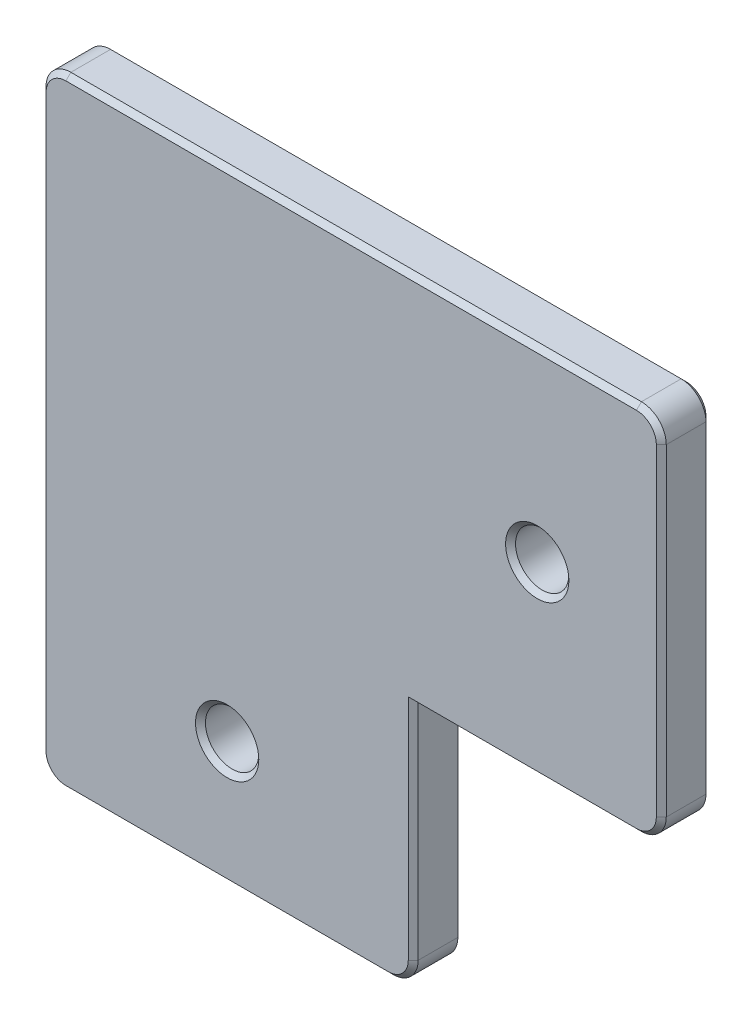
ISO-10303-21;
HEADER;
FILE_DESCRIPTION(('STEP AP214'),'2;1');
FILE_NAME('part.step','',(''),(''),'','','');
FILE_SCHEMA(('AUTOMOTIVE_DESIGN { 1 0 10303 214 1 1 1 1 }'));
ENDSEC;
DATA;
#1=APPLICATION_CONTEXT('core data for automotive mechanical design processes');
#2=APPLICATION_PROTOCOL_DEFINITION('international standard','automotive_design',2000,#1);
#3=PRODUCT_CONTEXT('',#1,'mechanical');
#4=PRODUCT('Part','Part','',(#3));
#5=PRODUCT_RELATED_PRODUCT_CATEGORY('part','',(#4));
#6=PRODUCT_DEFINITION_FORMATION('','',#4);
#7=PRODUCT_DEFINITION_CONTEXT('part definition',#1,'design');
#8=PRODUCT_DEFINITION('design','',#6,#7);
#9=PRODUCT_DEFINITION_SHAPE('','',#8);
#10=(LENGTH_UNIT() NAMED_UNIT(*) SI_UNIT(.MILLI.,.METRE.));
#11=(NAMED_UNIT(*) PLANE_ANGLE_UNIT() SI_UNIT($,.RADIAN.));
#12=(NAMED_UNIT(*) SI_UNIT($,.STERADIAN.) SOLID_ANGLE_UNIT());
#13=UNCERTAINTY_MEASURE_WITH_UNIT(LENGTH_MEASURE(1.E-05),#10,'distance_accuracy_value','');
#14=(GEOMETRIC_REPRESENTATION_CONTEXT(3) GLOBAL_UNCERTAINTY_ASSIGNED_CONTEXT((#13)) GLOBAL_UNIT_ASSIGNED_CONTEXT((#10,
#11,#12)) REPRESENTATION_CONTEXT('',''));
#15=CARTESIAN_POINT('',(0.,0.,0.));
#16=DIRECTION('',(0.,0.,1.));
#17=DIRECTION('',(1.,0.,0.));
#18=AXIS2_PLACEMENT_3D('',#15,#16,#17);
#19=CARTESIAN_POINT('',(0.,0.,4.));
#20=DIRECTION('',(0.,0.,1.));
#21=DIRECTION('',(1.,0.,0.));
#22=AXIS2_PLACEMENT_3D('',#19,#20,#21);
#23=PLANE('',#22);
#24=CARTESIAN_POINT('',(40.0000000000003,-15.,4.));
#25=DIRECTION('',(0.,0.,1.));
#26=DIRECTION('',(1.,0.,0.));
#27=AXIS2_PLACEMENT_3D('',#24,#25,#26);
#28=CIRCLE('',#27,2.55);
#29=CARTESIAN_POINT('',(42.5500000000003,-15.,4.));
#30=VERTEX_POINT('',#29);
#31=EDGE_CURVE('E223',#30,#30,#28,.F.);
#32=ORIENTED_EDGE('',*,*,#31,.T.);
#33=EDGE_LOOP('',(#32));
#34=FACE_BOUND('',#33,.T.);
#35=DIRECTION('',(0.,1.,0.));
#36=VECTOR('',#35,1.);
#37=CARTESIAN_POINT('',(49.6000000000003,-2.,4.));
#38=LINE('',#37,#36);
#39=CARTESIAN_POINT('',(49.6000000000003,-28.,4.));
#40=VERTEX_POINT('',#39);
#41=CARTESIAN_POINT('',(49.6000000000003,-2.,4.));
#42=VERTEX_POINT('',#41);
#43=EDGE_CURVE('E220',#40,#42,#38,.T.);
#44=ORIENTED_EDGE('',*,*,#43,.T.);
#45=CARTESIAN_POINT('',(48.0000000000003,-2.,4.));
#46=DIRECTION('',(0.,0.,1.));
#47=DIRECTION('',(1.,0.,0.));
#48=AXIS2_PLACEMENT_3D('',#45,#46,#47);
#49=CIRCLE('',#48,1.6);
#50=CARTESIAN_POINT('',(48.0000000000003,-0.399999999999998,4.));
#51=VERTEX_POINT('',#50);
#52=EDGE_CURVE('E199',#42,#51,#49,.T.);
#53=ORIENTED_EDGE('',*,*,#52,.T.);
#54=DIRECTION('',(-1.,0.,0.));
#55=VECTOR('',#54,1.);
#56=CARTESIAN_POINT('',(2.,-0.399999999999998,4.));
#57=LINE('',#56,#55);
#58=CARTESIAN_POINT('',(2.,-0.399999999999998,4.));
#59=VERTEX_POINT('',#58);
#60=EDGE_CURVE('E208',#51,#59,#57,.T.);
#61=ORIENTED_EDGE('',*,*,#60,.T.);
#62=CARTESIAN_POINT('',(2.,-2.,4.));
#63=DIRECTION('',(0.,0.,1.));
#64=DIRECTION('',(1.,0.,0.));
#65=AXIS2_PLACEMENT_3D('',#62,#63,#64);
#66=CIRCLE('',#65,1.6);
#67=CARTESIAN_POINT('',(0.399999999999998,-2.,4.));
#68=VERTEX_POINT('',#67);
#69=EDGE_CURVE('E215',#59,#68,#66,.T.);
#70=ORIENTED_EDGE('',*,*,#69,.T.);
#71=DIRECTION('',(0.,-1.,0.));
#72=VECTOR('',#71,1.);
#73=CARTESIAN_POINT('',(0.399999999999998,-48.,4.));
#74=LINE('',#73,#72);
#75=CARTESIAN_POINT('',(0.399999999999998,-48.,4.));
#76=VERTEX_POINT('',#75);
#77=EDGE_CURVE('E499',#68,#76,#74,.T.);
#78=ORIENTED_EDGE('',*,*,#77,.T.);
#79=CARTESIAN_POINT('',(2.,-48.,4.));
#80=DIRECTION('',(0.,0.,1.));
#81=DIRECTION('',(1.,0.,0.));
#82=AXIS2_PLACEMENT_3D('',#79,#80,#81);
#83=CIRCLE('',#82,1.6);
#84=CARTESIAN_POINT('',(2.,-49.6,4.));
#85=VERTEX_POINT('',#84);
#86=EDGE_CURVE('E502',#76,#85,#83,.T.);
#87=ORIENTED_EDGE('',*,*,#86,.T.);
#88=DIRECTION('',(1.,0.,0.));
#89=VECTOR('',#88,1.);
#90=CARTESIAN_POINT('',(28.0000000000003,-49.6,4.));
#91=LINE('',#90,#89);
#92=CARTESIAN_POINT('',(28.0000000000003,-49.6,4.));
#93=VERTEX_POINT('',#92);
#94=EDGE_CURVE('E505',#85,#93,#91,.T.);
#95=ORIENTED_EDGE('',*,*,#94,.T.);
#96=CARTESIAN_POINT('',(28.0000000000003,-48.,4.));
#97=DIRECTION('',(0.,0.,1.));
#98=DIRECTION('',(1.,0.,0.));
#99=AXIS2_PLACEMENT_3D('',#96,#97,#98);
#100=CIRCLE('',#99,1.6);
#101=CARTESIAN_POINT('',(29.6000000000003,-48.,4.));
#102=VERTEX_POINT('',#101);
#103=EDGE_CURVE('E508',#93,#102,#100,.T.);
#104=ORIENTED_EDGE('',*,*,#103,.T.);
#105=DIRECTION('',(0.,1.,0.));
#106=VECTOR('',#105,1.);
#107=CARTESIAN_POINT('',(29.6000000000003,-30.,4.));
#108=LINE('',#107,#106);
#109=CARTESIAN_POINT('',(29.6000000000003,-29.6,4.));
#110=VERTEX_POINT('',#109);
#111=EDGE_CURVE('E511',#102,#110,#108,.T.);
#112=ORIENTED_EDGE('',*,*,#111,.T.);
#113=DIRECTION('',(1.,0.,0.));
#114=VECTOR('',#113,1.);
#115=CARTESIAN_POINT('',(48.0000000000003,-29.6,4.));
#116=LINE('',#115,#114);
#117=CARTESIAN_POINT('',(48.0000000000003,-29.6,4.));
#118=VERTEX_POINT('',#117);
#119=EDGE_CURVE('E514',#110,#118,#116,.T.);
#120=ORIENTED_EDGE('',*,*,#119,.T.);
#121=CARTESIAN_POINT('',(48.0000000000003,-28.,4.));
#122=DIRECTION('',(0.,0.,1.));
#123=DIRECTION('',(1.,0.,0.));
#124=AXIS2_PLACEMENT_3D('',#121,#122,#123);
#125=CIRCLE('',#124,1.6);
#126=EDGE_CURVE('E230',#118,#40,#125,.T.);
#127=ORIENTED_EDGE('',*,*,#126,.T.);
#128=EDGE_LOOP('',(#44,#53,#61,#70,#78,#87,#95,#104,#112,#120,#127));
#129=FACE_BOUND('',#128,.T.);
#130=CARTESIAN_POINT('',(15.0000000000002,-40.,4.));
#131=DIRECTION('',(0.,0.,1.));
#132=DIRECTION('',(1.,0.,0.));
#133=AXIS2_PLACEMENT_3D('',#130,#131,#132);
#134=CIRCLE('',#133,2.54999999999998);
#135=CARTESIAN_POINT('',(17.5500000000002,-40.,4.));
#136=VERTEX_POINT('',#135);
#137=EDGE_CURVE('E216',#136,#136,#134,.F.);
#138=ORIENTED_EDGE('',*,*,#137,.T.);
#139=EDGE_LOOP('',(#138));
#140=FACE_BOUND('',#139,.T.);
#141=ADVANCED_FACE('F41',(#34,#129,#140),#23,.T.);
#142=CARTESIAN_POINT('',(0.,0.,0.));
#143=DIRECTION('',(0.,0.,1.));
#144=DIRECTION('',(1.,0.,0.));
#145=AXIS2_PLACEMENT_3D('',#142,#143,#144);
#146=PLANE('',#145);
#147=CARTESIAN_POINT('',(40.0000000000003,-15.,0.));
#148=DIRECTION('',(0.,0.,1.));
#149=DIRECTION('',(1.,0.,0.));
#150=AXIS2_PLACEMENT_3D('',#147,#148,#149);
#151=CIRCLE('',#150,2.55);
#152=CARTESIAN_POINT('',(42.5500000000003,-15.,0.));
#153=VERTEX_POINT('',#152);
#154=EDGE_CURVE('E11',#153,#153,#151,.T.);
#155=ORIENTED_EDGE('',*,*,#154,.T.);
#156=EDGE_LOOP('',(#155));
#157=FACE_BOUND('',#156,.T.);
#158=CARTESIAN_POINT('',(15.0000000000002,-40.,0.));
#159=DIRECTION('',(0.,0.,1.));
#160=DIRECTION('',(1.,0.,0.));
#161=AXIS2_PLACEMENT_3D('',#158,#159,#160);
#162=CIRCLE('',#161,2.55);
#163=CARTESIAN_POINT('',(17.5500000000002,-40.,0.));
#164=VERTEX_POINT('',#163);
#165=EDGE_CURVE('E52',#164,#164,#162,.T.);
#166=ORIENTED_EDGE('',*,*,#165,.T.);
#167=EDGE_LOOP('',(#166));
#168=FACE_BOUND('',#167,.T.);
#169=DIRECTION('',(-1.,0.,0.));
#170=VECTOR('',#169,1.);
#171=CARTESIAN_POINT('',(0.,-49.6,0.));
#172=LINE('',#171,#170);
#173=CARTESIAN_POINT('',(28.0000000000003,-49.6,0.));
#174=VERTEX_POINT('',#173);
#175=CARTESIAN_POINT('',(2.,-49.6,0.));
#176=VERTEX_POINT('',#175);
#177=EDGE_CURVE('E60',#174,#176,#172,.T.);
#178=ORIENTED_EDGE('',*,*,#177,.T.);
#179=CARTESIAN_POINT('',(2.,-48.,0.));
#180=DIRECTION('',(0.,0.,1.));
#181=DIRECTION('',(1.,0.,0.));
#182=AXIS2_PLACEMENT_3D('',#179,#180,#181);
#183=CIRCLE('',#182,1.6);
#184=CARTESIAN_POINT('',(0.399999999999998,-48.,0.));
#185=VERTEX_POINT('',#184);
#186=EDGE_CURVE('E335',#176,#185,#183,.F.);
#187=ORIENTED_EDGE('',*,*,#186,.T.);
#188=DIRECTION('',(0.,1.,0.));
#189=VECTOR('',#188,1.);
#190=CARTESIAN_POINT('',(0.399999999999998,0.,0.));
#191=LINE('',#190,#189);
#192=CARTESIAN_POINT('',(0.399999999999998,-2.,0.));
#193=VERTEX_POINT('',#192);
#194=EDGE_CURVE('E307',#185,#193,#191,.T.);
#195=ORIENTED_EDGE('',*,*,#194,.T.);
#196=CARTESIAN_POINT('',(2.,-2.,0.));
#197=DIRECTION('',(0.,0.,1.));
#198=DIRECTION('',(1.,0.,0.));
#199=AXIS2_PLACEMENT_3D('',#196,#197,#198);
#200=CIRCLE('',#199,1.6);
#201=CARTESIAN_POINT('',(2.,-0.399999999999999,0.));
#202=VERTEX_POINT('',#201);
#203=EDGE_CURVE('E310',#193,#202,#200,.F.);
#204=ORIENTED_EDGE('',*,*,#203,.T.);
#205=DIRECTION('',(1.,0.,0.));
#206=VECTOR('',#205,1.);
#207=CARTESIAN_POINT('',(0.,-0.399999999999998,0.));
#208=LINE('',#207,#206);
#209=CARTESIAN_POINT('',(48.0000000000003,-0.399999999999998,0.));
#210=VERTEX_POINT('',#209);
#211=EDGE_CURVE('E313',#202,#210,#208,.T.);
#212=ORIENTED_EDGE('',*,*,#211,.T.);
#213=CARTESIAN_POINT('',(48.0000000000003,-2.,0.));
#214=DIRECTION('',(0.,0.,1.));
#215=DIRECTION('',(1.,0.,0.));
#216=AXIS2_PLACEMENT_3D('',#213,#214,#215);
#217=CIRCLE('',#216,1.6);
#218=CARTESIAN_POINT('',(49.6000000000003,-2.,0.));
#219=VERTEX_POINT('',#218);
#220=EDGE_CURVE('E316',#210,#219,#217,.F.);
#221=ORIENTED_EDGE('',*,*,#220,.T.);
#222=DIRECTION('',(0.,-1.,0.));
#223=VECTOR('',#222,1.);
#224=CARTESIAN_POINT('',(49.6000000000003,0.,0.));
#225=LINE('',#224,#223);
#226=CARTESIAN_POINT('',(49.6000000000003,-28.,0.));
#227=VERTEX_POINT('',#226);
#228=EDGE_CURVE('E319',#219,#227,#225,.T.);
#229=ORIENTED_EDGE('',*,*,#228,.T.);
#230=CARTESIAN_POINT('',(48.0000000000003,-28.,0.));
#231=DIRECTION('',(0.,0.,1.));
#232=DIRECTION('',(1.,0.,0.));
#233=AXIS2_PLACEMENT_3D('',#230,#231,#232);
#234=CIRCLE('',#233,1.6);
#235=CARTESIAN_POINT('',(48.0000000000003,-29.6,0.));
#236=VERTEX_POINT('',#235);
#237=EDGE_CURVE('E322',#227,#236,#234,.F.);
#238=ORIENTED_EDGE('',*,*,#237,.T.);
#239=DIRECTION('',(-1.,0.,0.));
#240=VECTOR('',#239,1.);
#241=CARTESIAN_POINT('',(0.,-29.6,0.));
#242=LINE('',#241,#240);
#243=CARTESIAN_POINT('',(29.6000000000003,-29.6,0.));
#244=VERTEX_POINT('',#243);
#245=EDGE_CURVE('E325',#236,#244,#242,.T.);
#246=ORIENTED_EDGE('',*,*,#245,.T.);
#247=DIRECTION('',(0.,-1.,0.));
#248=VECTOR('',#247,1.);
#249=CARTESIAN_POINT('',(29.6000000000004,0.,0.));
#250=LINE('',#249,#248);
#251=CARTESIAN_POINT('',(29.6000000000003,-48.,0.));
#252=VERTEX_POINT('',#251);
#253=EDGE_CURVE('E328',#244,#252,#250,.T.);
#254=ORIENTED_EDGE('',*,*,#253,.T.);
#255=CARTESIAN_POINT('',(28.0000000000003,-48.,0.));
#256=DIRECTION('',(0.,0.,1.));
#257=DIRECTION('',(1.,0.,0.));
#258=AXIS2_PLACEMENT_3D('',#255,#256,#257);
#259=CIRCLE('',#258,1.6);
#260=EDGE_CURVE('E65',#252,#174,#259,.F.);
#261=ORIENTED_EDGE('',*,*,#260,.T.);
#262=EDGE_LOOP('',(#178,#187,#195,#204,#212,#221,#229,#238,#246,#254,#261));
#263=FACE_BOUND('',#262,.T.);
#264=ADVANCED_FACE('F429',(#157,#168,#263),#146,.F.);
#265=CARTESIAN_POINT('',(0.,-50.,4.));
#266=DIRECTION('',(1.,0.,0.));
#267=DIRECTION('',(0.,0.,-1.));
#268=AXIS2_PLACEMENT_3D('',#265,#266,#267);
#269=PLANE('',#268);
#270=DIRECTION('',(0.,0.,-1.));
#271=VECTOR('',#270,1.);
#272=CARTESIAN_POINT('',(0.,-48.,4.));
#273=LINE('',#272,#271);
#274=CARTESIAN_POINT('',(0.,-48.,0.399999999999998));
#275=VERTEX_POINT('',#274);
#276=CARTESIAN_POINT('',(0.,-48.,3.6));
#277=VERTEX_POINT('',#276);
#278=EDGE_CURVE('E576',#275,#277,#273,.F.);
#279=ORIENTED_EDGE('',*,*,#278,.T.);
#280=DIRECTION('',(0.,1.,0.));
#281=VECTOR('',#280,1.);
#282=CARTESIAN_POINT('',(0.,-2.,3.6));
#283=LINE('',#282,#281);
#284=CARTESIAN_POINT('',(0.,-2.,3.6));
#285=VERTEX_POINT('',#284);
#286=EDGE_CURVE('E284',#277,#285,#283,.T.);
#287=ORIENTED_EDGE('',*,*,#286,.T.);
#288=DIRECTION('',(0.,0.,-1.));
#289=VECTOR('',#288,1.);
#290=CARTESIAN_POINT('',(0.,-2.,4.));
#291=LINE('',#290,#289);
#292=CARTESIAN_POINT('',(0.,-2.,0.399999999999998));
#293=VERTEX_POINT('',#292);
#294=EDGE_CURVE('E463',#285,#293,#291,.T.);
#295=ORIENTED_EDGE('',*,*,#294,.T.);
#296=DIRECTION('',(0.,-1.,0.));
#297=VECTOR('',#296,1.);
#298=CARTESIAN_POINT('',(0.,-50.,0.399999999999998));
#299=LINE('',#298,#297);
#300=EDGE_CURVE('E281',#293,#275,#299,.T.);
#301=ORIENTED_EDGE('',*,*,#300,.T.);
#302=EDGE_LOOP('',(#279,#287,#295,#301));
#303=FACE_BOUND('',#302,.T.);
#304=ADVANCED_FACE('F609',(#303),#269,.F.);
#305=CARTESIAN_POINT('',(0.,-50.,4.));
#306=DIRECTION('',(0.,1.,0.));
#307=DIRECTION('',(0.,0.,1.));
#308=AXIS2_PLACEMENT_3D('',#305,#306,#307);
#309=PLANE('',#308);
#310=DIRECTION('',(0.,0.,-1.));
#311=VECTOR('',#310,1.);
#312=CARTESIAN_POINT('',(28.0000000000003,-50.,4.));
#313=LINE('',#312,#311);
#314=CARTESIAN_POINT('',(28.0000000000003,-50.,0.399999999999998));
#315=VERTEX_POINT('',#314);
#316=CARTESIAN_POINT('',(28.0000000000003,-50.,3.6));
#317=VERTEX_POINT('',#316);
#318=EDGE_CURVE('E474',#315,#317,#313,.F.);
#319=ORIENTED_EDGE('',*,*,#318,.T.);
#320=DIRECTION('',(-1.,0.,0.));
#321=VECTOR('',#320,1.);
#322=CARTESIAN_POINT('',(2.,-50.,3.6));
#323=LINE('',#322,#321);
#324=CARTESIAN_POINT('',(2.,-50.,3.6));
#325=VERTEX_POINT('',#324);
#326=EDGE_CURVE('E271',#317,#325,#323,.T.);
#327=ORIENTED_EDGE('',*,*,#326,.T.);
#328=DIRECTION('',(0.,0.,-1.));
#329=VECTOR('',#328,1.);
#330=CARTESIAN_POINT('',(2.,-50.,4.));
#331=LINE('',#330,#329);
#332=CARTESIAN_POINT('',(2.,-50.,0.399999999999998));
#333=VERTEX_POINT('',#332);
#334=EDGE_CURVE('E478',#325,#333,#331,.T.);
#335=ORIENTED_EDGE('',*,*,#334,.T.);
#336=DIRECTION('',(1.,0.,0.));
#337=VECTOR('',#336,1.);
#338=CARTESIAN_POINT('',(0.,-50.,0.399999999999998));
#339=LINE('',#338,#337);
#340=EDGE_CURVE('E268',#333,#315,#339,.T.);
#341=ORIENTED_EDGE('',*,*,#340,.T.);
#342=EDGE_LOOP('',(#319,#327,#335,#341));
#343=FACE_BOUND('',#342,.T.);
#344=ADVANCED_FACE('F570',(#343),#309,.F.);
#345=CARTESIAN_POINT('',(30.0000000000003,-50.,4.));
#346=DIRECTION('',(-1.,0.,0.));
#347=DIRECTION('',(0.,-1.,0.));
#348=AXIS2_PLACEMENT_3D('',#345,#346,#347);
#349=PLANE('',#348);
#350=DIRECTION('',(0.,0.,-1.));
#351=VECTOR('',#350,1.);
#352=CARTESIAN_POINT('',(30.0000000000003,-30.,4.));
#353=LINE('',#352,#351);
#354=CARTESIAN_POINT('',(30.0000000000003,-30.,3.6));
#355=VERTEX_POINT('',#354);
#356=CARTESIAN_POINT('',(30.0000000000003,-30.,0.399999999999998));
#357=VERTEX_POINT('',#356);
#358=EDGE_CURVE('E377',#355,#357,#353,.T.);
#359=ORIENTED_EDGE('',*,*,#358,.F.);
#360=DIRECTION('',(0.,-1.,0.));
#361=VECTOR('',#360,1.);
#362=CARTESIAN_POINT('',(30.0000000000003,-48.,3.6));
#363=LINE('',#362,#361);
#364=CARTESIAN_POINT('',(30.0000000000003,-48.,3.6));
#365=VERTEX_POINT('',#364);
#366=EDGE_CURVE('E259',#355,#365,#363,.T.);
#367=ORIENTED_EDGE('',*,*,#366,.T.);
#368=DIRECTION('',(0.,0.,-1.));
#369=VECTOR('',#368,1.);
#370=CARTESIAN_POINT('',(30.0000000000003,-48.,4.));
#371=LINE('',#370,#369);
#372=CARTESIAN_POINT('',(30.0000000000003,-48.,0.399999999999998));
#373=VERTEX_POINT('',#372);
#374=EDGE_CURVE('E482',#365,#373,#371,.T.);
#375=ORIENTED_EDGE('',*,*,#374,.T.);
#376=DIRECTION('',(0.,1.,0.));
#377=VECTOR('',#376,1.);
#378=CARTESIAN_POINT('',(30.0000000000003,-50.,0.399999999999998));
#379=LINE('',#378,#377);
#380=EDGE_CURVE('E256',#373,#357,#379,.T.);
#381=ORIENTED_EDGE('',*,*,#380,.T.);
#382=EDGE_LOOP('',(#359,#367,#375,#381));
#383=FACE_BOUND('',#382,.T.);
#384=ADVANCED_FACE('F551',(#383),#349,.F.);
#385=CARTESIAN_POINT('',(30.0000000000003,-30.,4.));
#386=DIRECTION('',(0.,1.,0.));
#387=DIRECTION('',(0.,0.,1.));
#388=AXIS2_PLACEMENT_3D('',#385,#386,#387);
#389=PLANE('',#388);
#390=DIRECTION('',(0.,0.,-1.));
#391=VECTOR('',#390,1.);
#392=CARTESIAN_POINT('',(48.0000000000003,-30.,4.));
#393=LINE('',#392,#391);
#394=CARTESIAN_POINT('',(48.0000000000003,-30.,0.399999999999998));
#395=VERTEX_POINT('',#394);
#396=CARTESIAN_POINT('',(48.0000000000003,-30.,3.6));
#397=VERTEX_POINT('',#396);
#398=EDGE_CURVE('E470',#395,#397,#393,.F.);
#399=ORIENTED_EDGE('',*,*,#398,.T.);
#400=DIRECTION('',(-1.,0.,0.));
#401=VECTOR('',#400,1.);
#402=CARTESIAN_POINT('',(30.0000000000003,-30.,3.6));
#403=LINE('',#402,#401);
#404=EDGE_CURVE('E253',#397,#355,#403,.T.);
#405=ORIENTED_EDGE('',*,*,#404,.T.);
#406=ORIENTED_EDGE('',*,*,#358,.T.);
#407=DIRECTION('',(1.,0.,0.));
#408=VECTOR('',#407,1.);
#409=CARTESIAN_POINT('',(30.0000000000003,-30.,0.399999999999998));
#410=LINE('',#409,#408);
#411=EDGE_CURVE('E250',#357,#395,#410,.T.);
#412=ORIENTED_EDGE('',*,*,#411,.T.);
#413=EDGE_LOOP('',(#399,#405,#406,#412));
#414=FACE_BOUND('',#413,.T.);
#415=ADVANCED_FACE('F538',(#414),#389,.F.);
#416=CARTESIAN_POINT('',(50.0000000000003,-30.,4.));
#417=DIRECTION('',(-1.,0.,0.));
#418=DIRECTION('',(0.,0.,1.));
#419=AXIS2_PLACEMENT_3D('',#416,#417,#418);
#420=PLANE('',#419);
#421=DIRECTION('',(0.,0.,-1.));
#422=VECTOR('',#421,1.);
#423=CARTESIAN_POINT('',(50.0000000000003,-2.,4.));
#424=LINE('',#423,#422);
#425=CARTESIAN_POINT('',(50.0000000000003,-2.,0.399999999999998));
#426=VERTEX_POINT('',#425);
#427=CARTESIAN_POINT('',(50.0000000000003,-2.,3.6));
#428=VERTEX_POINT('',#427);
#429=EDGE_CURVE('E461',#426,#428,#424,.F.);
#430=ORIENTED_EDGE('',*,*,#429,.T.);
#431=DIRECTION('',(0.,-1.,0.));
#432=VECTOR('',#431,1.);
#433=CARTESIAN_POINT('',(50.0000000000003,-28.,3.6));
#434=LINE('',#433,#432);
#435=CARTESIAN_POINT('',(50.0000000000003,-28.,3.6));
#436=VERTEX_POINT('',#435);
#437=EDGE_CURVE('E241',#428,#436,#434,.T.);
#438=ORIENTED_EDGE('',*,*,#437,.T.);
#439=DIRECTION('',(0.,0.,-1.));
#440=VECTOR('',#439,1.);
#441=CARTESIAN_POINT('',(50.0000000000003,-28.,4.));
#442=LINE('',#441,#440);
#443=CARTESIAN_POINT('',(50.0000000000003,-28.,0.399999999999998));
#444=VERTEX_POINT('',#443);
#445=EDGE_CURVE('E456',#436,#444,#442,.T.);
#446=ORIENTED_EDGE('',*,*,#445,.T.);
#447=DIRECTION('',(0.,1.,0.));
#448=VECTOR('',#447,1.);
#449=CARTESIAN_POINT('',(50.0000000000003,-30.,0.399999999999998));
#450=LINE('',#449,#448);
#451=EDGE_CURVE('E238',#444,#426,#450,.T.);
#452=ORIENTED_EDGE('',*,*,#451,.T.);
#453=EDGE_LOOP('',(#430,#438,#446,#452));
#454=FACE_BOUND('',#453,.T.);
#455=ADVANCED_FACE('F532',(#454),#420,.F.);
#456=CARTESIAN_POINT('',(50.0000000000003,0.,4.));
#457=DIRECTION('',(0.,-1.,0.));
#458=DIRECTION('',(0.,0.,-1.));
#459=AXIS2_PLACEMENT_3D('',#456,#457,#458);
#460=PLANE('',#459);
#461=DIRECTION('',(0.,0.,-1.));
#462=VECTOR('',#461,1.);
#463=CARTESIAN_POINT('',(2.,0.,4.));
#464=LINE('',#463,#462);
#465=CARTESIAN_POINT('',(2.,0.,0.399999999999998));
#466=VERTEX_POINT('',#465);
#467=CARTESIAN_POINT('',(2.,0.,3.6));
#468=VERTEX_POINT('',#467);
#469=EDGE_CURVE('E447',#466,#468,#464,.F.);
#470=ORIENTED_EDGE('',*,*,#469,.T.);
#471=DIRECTION('',(1.,0.,0.));
#472=VECTOR('',#471,1.);
#473=CARTESIAN_POINT('',(48.0000000000003,0.,3.6));
#474=LINE('',#473,#472);
#475=CARTESIAN_POINT('',(48.0000000000003,0.,3.6));
#476=VERTEX_POINT('',#475);
#477=EDGE_CURVE('E296',#468,#476,#474,.T.);
#478=ORIENTED_EDGE('',*,*,#477,.T.);
#479=DIRECTION('',(0.,0.,-1.));
#480=VECTOR('',#479,1.);
#481=CARTESIAN_POINT('',(48.0000000000003,0.,4.));
#482=LINE('',#481,#480);
#483=CARTESIAN_POINT('',(48.0000000000003,0.,0.399999999999998));
#484=VERTEX_POINT('',#483);
#485=EDGE_CURVE('E449',#476,#484,#482,.T.);
#486=ORIENTED_EDGE('',*,*,#485,.T.);
#487=DIRECTION('',(-1.,0.,0.));
#488=VECTOR('',#487,1.);
#489=CARTESIAN_POINT('',(50.0000000000003,0.,0.399999999999998));
#490=LINE('',#489,#488);
#491=EDGE_CURVE('E293',#484,#466,#490,.T.);
#492=ORIENTED_EDGE('',*,*,#491,.T.);
#493=EDGE_LOOP('',(#470,#478,#486,#492));
#494=FACE_BOUND('',#493,.T.);
#495=ADVANCED_FACE('F446',(#494),#460,.F.);
#496=CARTESIAN_POINT('',(15.0000000000002,-40.,4.));
#497=DIRECTION('',(0.,0.,-1.));
#498=DIRECTION('',(-1.,0.,0.));
#499=AXIS2_PLACEMENT_3D('',#496,#497,#498);
#500=CYLINDRICAL_SURFACE('',#499,2.15);
#501=CARTESIAN_POINT('',(15.0000000000002,-40.,3.60000000000002));
#502=DIRECTION('',(0.,0.,1.));
#503=DIRECTION('',(1.,0.,0.));
#504=AXIS2_PLACEMENT_3D('',#501,#502,#503);
#505=CIRCLE('',#504,2.15);
#506=CARTESIAN_POINT('',(17.1500000000002,-40.,3.60000000000002));
#507=VERTEX_POINT('',#506);
#508=EDGE_CURVE('E303',#507,#507,#505,.T.);
#509=ORIENTED_EDGE('',*,*,#508,.T.);
#510=EDGE_LOOP('',(#509));
#511=FACE_BOUND('',#510,.T.);
#512=CARTESIAN_POINT('',(15.0000000000002,-40.,0.400000000000008));
#513=DIRECTION('',(0.,0.,1.));
#514=DIRECTION('',(1.,0.,0.));
#515=AXIS2_PLACEMENT_3D('',#512,#513,#514);
#516=CIRCLE('',#515,2.15);
#517=CARTESIAN_POINT('',(17.1500000000002,-40.,0.400000000000008));
#518=VERTEX_POINT('',#517);
#519=EDGE_CURVE('E299',#518,#518,#516,.F.);
#520=ORIENTED_EDGE('',*,*,#519,.T.);
#521=EDGE_LOOP('',(#520));
#522=FACE_BOUND('',#521,.T.);
#523=ADVANCED_FACE('F613',(#511,#522),#500,.F.);
#524=CARTESIAN_POINT('',(40.0000000000003,-15.,4.));
#525=DIRECTION('',(0.,0.,-1.));
#526=DIRECTION('',(-1.,0.,0.));
#527=AXIS2_PLACEMENT_3D('',#524,#525,#526);
#528=CYLINDRICAL_SURFACE('',#527,2.15);
#529=CARTESIAN_POINT('',(40.0000000000003,-15.,3.6));
#530=DIRECTION('',(0.,0.,1.));
#531=DIRECTION('',(1.,0.,0.));
#532=AXIS2_PLACEMENT_3D('',#529,#530,#531);
#533=CIRCLE('',#532,2.15);
#534=CARTESIAN_POINT('',(42.1500000000003,-15.,3.6));
#535=VERTEX_POINT('',#534);
#536=EDGE_CURVE('E490',#535,#535,#533,.T.);
#537=ORIENTED_EDGE('',*,*,#536,.T.);
#538=EDGE_LOOP('',(#537));
#539=FACE_BOUND('',#538,.T.);
#540=CARTESIAN_POINT('',(40.0000000000003,-15.,0.399999999999996));
#541=DIRECTION('',(0.,0.,1.));
#542=DIRECTION('',(1.,0.,0.));
#543=AXIS2_PLACEMENT_3D('',#540,#541,#542);
#544=CIRCLE('',#543,2.15);
#545=CARTESIAN_POINT('',(42.1500000000003,-15.,0.399999999999996));
#546=VERTEX_POINT('',#545);
#547=EDGE_CURVE('E486',#546,#546,#544,.F.);
#548=ORIENTED_EDGE('',*,*,#547,.T.);
#549=EDGE_LOOP('',(#548));
#550=FACE_BOUND('',#549,.T.);
#551=ADVANCED_FACE('F631',(#539,#550),#528,.F.);
#552=CARTESIAN_POINT('',(2.,-2.,4.));
#553=DIRECTION('',(0.,0.,-1.));
#554=DIRECTION('',(-1.,0.,0.));
#555=AXIS2_PLACEMENT_3D('',#552,#553,#554);
#556=CYLINDRICAL_SURFACE('',#555,2.);
#557=ORIENTED_EDGE('',*,*,#294,.F.);
#558=CARTESIAN_POINT('',(2.,-2.,3.6));
#559=DIRECTION('',(0.,0.,1.));
#560=DIRECTION('',(1.,0.,0.));
#561=AXIS2_PLACEMENT_3D('',#558,#559,#560);
#562=CIRCLE('',#561,2.);
#563=EDGE_CURVE('E290',#285,#468,#562,.F.);
#564=ORIENTED_EDGE('',*,*,#563,.T.);
#565=ORIENTED_EDGE('',*,*,#469,.F.);
#566=CARTESIAN_POINT('',(2.,-2.,0.399999999999998));
#567=DIRECTION('',(0.,0.,1.));
#568=DIRECTION('',(1.,0.,0.));
#569=AXIS2_PLACEMENT_3D('',#566,#567,#568);
#570=CIRCLE('',#569,2.);
#571=EDGE_CURVE('E287',#466,#293,#570,.T.);
#572=ORIENTED_EDGE('',*,*,#571,.T.);
#573=EDGE_LOOP('',(#557,#564,#565,#572));
#574=FACE_BOUND('',#573,.T.);
#575=ADVANCED_FACE('F452',(#574),#556,.T.);
#576=CARTESIAN_POINT('',(48.0000000000003,-2.,4.));
#577=DIRECTION('',(0.,0.,-1.));
#578=DIRECTION('',(-1.,0.,0.));
#579=AXIS2_PLACEMENT_3D('',#576,#577,#578);
#580=CYLINDRICAL_SURFACE('',#579,2.);
#581=ORIENTED_EDGE('',*,*,#485,.F.);
#582=CARTESIAN_POINT('',(48.0000000000003,-2.,3.6));
#583=DIRECTION('',(0.,0.,1.));
#584=DIRECTION('',(1.,0.,0.));
#585=AXIS2_PLACEMENT_3D('',#582,#583,#584);
#586=CIRCLE('',#585,2.);
#587=EDGE_CURVE('E201',#476,#428,#586,.F.);
#588=ORIENTED_EDGE('',*,*,#587,.T.);
#589=ORIENTED_EDGE('',*,*,#429,.F.);
#590=CARTESIAN_POINT('',(48.0000000000003,-2.,0.399999999999998));
#591=DIRECTION('',(0.,0.,1.));
#592=DIRECTION('',(1.,0.,0.));
#593=AXIS2_PLACEMENT_3D('',#590,#591,#592);
#594=CIRCLE('',#593,2.);
#595=EDGE_CURVE('E228',#426,#484,#594,.T.);
#596=ORIENTED_EDGE('',*,*,#595,.T.);
#597=EDGE_LOOP('',(#581,#588,#589,#596));
#598=FACE_BOUND('',#597,.T.);
#599=ADVANCED_FACE('F531',(#598),#580,.T.);
#600=CARTESIAN_POINT('',(48.0000000000003,-28.,4.));
#601=DIRECTION('',(0.,0.,-1.));
#602=DIRECTION('',(-1.,0.,0.));
#603=AXIS2_PLACEMENT_3D('',#600,#601,#602);
#604=CYLINDRICAL_SURFACE('',#603,2.);
#605=ORIENTED_EDGE('',*,*,#445,.F.);
#606=CARTESIAN_POINT('',(48.0000000000003,-28.,3.6));
#607=DIRECTION('',(0.,0.,1.));
#608=DIRECTION('',(1.,0.,0.));
#609=AXIS2_PLACEMENT_3D('',#606,#607,#608);
#610=CIRCLE('',#609,2.);
#611=EDGE_CURVE('E247',#436,#397,#610,.F.);
#612=ORIENTED_EDGE('',*,*,#611,.T.);
#613=ORIENTED_EDGE('',*,*,#398,.F.);
#614=CARTESIAN_POINT('',(48.0000000000003,-28.,0.399999999999998));
#615=DIRECTION('',(0.,0.,1.));
#616=DIRECTION('',(1.,0.,0.));
#617=AXIS2_PLACEMENT_3D('',#614,#615,#616);
#618=CIRCLE('',#617,2.);
#619=EDGE_CURVE('E244',#395,#444,#618,.T.);
#620=ORIENTED_EDGE('',*,*,#619,.T.);
#621=EDGE_LOOP('',(#605,#612,#613,#620));
#622=FACE_BOUND('',#621,.T.);
#623=ADVANCED_FACE('F534',(#622),#604,.T.);
#624=CARTESIAN_POINT('',(2.,-48.,4.));
#625=DIRECTION('',(0.,0.,-1.));
#626=DIRECTION('',(-1.,0.,0.));
#627=AXIS2_PLACEMENT_3D('',#624,#625,#626);
#628=CYLINDRICAL_SURFACE('',#627,2.);
#629=ORIENTED_EDGE('',*,*,#334,.F.);
#630=CARTESIAN_POINT('',(2.,-48.,3.6));
#631=DIRECTION('',(0.,0.,1.));
#632=DIRECTION('',(1.,0.,0.));
#633=AXIS2_PLACEMENT_3D('',#630,#631,#632);
#634=CIRCLE('',#633,2.);
#635=EDGE_CURVE('E278',#325,#277,#634,.F.);
#636=ORIENTED_EDGE('',*,*,#635,.T.);
#637=ORIENTED_EDGE('',*,*,#278,.F.);
#638=CARTESIAN_POINT('',(2.,-48.,0.399999999999998));
#639=DIRECTION('',(0.,0.,1.));
#640=DIRECTION('',(1.,0.,0.));
#641=AXIS2_PLACEMENT_3D('',#638,#639,#640);
#642=CIRCLE('',#641,2.);
#643=EDGE_CURVE('E274',#275,#333,#642,.T.);
#644=ORIENTED_EDGE('',*,*,#643,.T.);
#645=EDGE_LOOP('',(#629,#636,#637,#644));
#646=FACE_BOUND('',#645,.T.);
#647=ADVANCED_FACE('F572',(#646),#628,.T.);
#648=CARTESIAN_POINT('',(28.0000000000003,-48.,4.));
#649=DIRECTION('',(0.,0.,-1.));
#650=DIRECTION('',(-1.,0.,0.));
#651=AXIS2_PLACEMENT_3D('',#648,#649,#650);
#652=CYLINDRICAL_SURFACE('',#651,2.);
#653=ORIENTED_EDGE('',*,*,#374,.F.);
#654=CARTESIAN_POINT('',(28.0000000000003,-48.,3.6));
#655=DIRECTION('',(0.,0.,1.));
#656=DIRECTION('',(1.,0.,0.));
#657=AXIS2_PLACEMENT_3D('',#654,#655,#656);
#658=CIRCLE('',#657,2.);
#659=EDGE_CURVE('E265',#365,#317,#658,.F.);
#660=ORIENTED_EDGE('',*,*,#659,.T.);
#661=ORIENTED_EDGE('',*,*,#318,.F.);
#662=CARTESIAN_POINT('',(28.0000000000003,-48.,0.399999999999998));
#663=DIRECTION('',(0.,0.,1.));
#664=DIRECTION('',(1.,0.,0.));
#665=AXIS2_PLACEMENT_3D('',#662,#663,#664);
#666=CIRCLE('',#665,2.);
#667=EDGE_CURVE('E262',#315,#373,#666,.T.);
#668=ORIENTED_EDGE('',*,*,#667,.T.);
#669=EDGE_LOOP('',(#653,#660,#661,#668));
#670=FACE_BOUND('',#669,.T.);
#671=ADVANCED_FACE('F555',(#670),#652,.T.);
#672=CARTESIAN_POINT('',(40.0000000000003,-15.,3.6));
#673=DIRECTION('',(0.,0.,1.));
#674=DIRECTION('',(1.,0.,0.));
#675=AXIS2_PLACEMENT_3D('',#672,#673,#674);
#676=CONICAL_SURFACE('',#675,2.15,0.785398163397442);
#677=ORIENTED_EDGE('',*,*,#31,.F.);
#678=EDGE_LOOP('',(#677));
#679=FACE_BOUND('',#678,.T.);
#680=ORIENTED_EDGE('',*,*,#536,.F.);
#681=EDGE_LOOP('',(#680));
#682=FACE_BOUND('',#681,.T.);
#683=ADVANCED_FACE('F640',(#679,#682),#676,.F.);
#684=CARTESIAN_POINT('',(28.0000000000003,-48.,4.));
#685=DIRECTION('',(0.,0.,-1.));
#686=DIRECTION('',(-1.,0.,0.));
#687=AXIS2_PLACEMENT_3D('',#684,#685,#686);
#688=CONICAL_SURFACE('',#687,1.6,0.785398163397446);
#689=DIRECTION('',(0.707106781186544,0.,-0.707106781186551));
#690=VECTOR('',#689,1.);
#691=CARTESIAN_POINT('',(29.6000000000003,-48.,4.));
#692=LINE('',#691,#690);
#693=EDGE_CURVE('E369',#102,#365,#692,.T.);
#694=ORIENTED_EDGE('',*,*,#693,.F.);
#695=ORIENTED_EDGE('',*,*,#103,.F.);
#696=DIRECTION('',(0.,0.707106781186548,0.707106781186548));
#697=VECTOR('',#696,1.);
#698=CARTESIAN_POINT('',(28.0000000000003,-50.,3.6));
#699=LINE('',#698,#697);
#700=EDGE_CURVE('E373',#317,#93,#699,.T.);
#701=ORIENTED_EDGE('',*,*,#700,.F.);
#702=ORIENTED_EDGE('',*,*,#659,.F.);
#703=EDGE_LOOP('',(#694,#695,#701,#702));
#704=FACE_BOUND('',#703,.T.);
#705=ADVANCED_FACE('F560',(#704),#688,.T.);
#706=CARTESIAN_POINT('',(0.,-49.6,4.));
#707=DIRECTION('',(0.,-0.707106781186548,0.707106781186548));
#708=DIRECTION('',(-1.,0.,0.));
#709=AXIS2_PLACEMENT_3D('',#706,#707,#708);
#710=PLANE('',#709);
#711=ORIENTED_EDGE('',*,*,#700,.T.);
#712=ORIENTED_EDGE('',*,*,#94,.F.);
#713=DIRECTION('',(0.,0.707106781186548,0.707106781186548));
#714=VECTOR('',#713,1.);
#715=CARTESIAN_POINT('',(2.,-50.,3.6));
#716=LINE('',#715,#714);
#717=EDGE_CURVE('E365',#325,#85,#716,.T.);
#718=ORIENTED_EDGE('',*,*,#717,.F.);
#719=ORIENTED_EDGE('',*,*,#326,.F.);
#720=EDGE_LOOP('',(#711,#712,#718,#719));
#721=FACE_BOUND('',#720,.T.);
#722=ADVANCED_FACE('F566',(#721),#710,.T.);
#723=CARTESIAN_POINT('',(29.6000000000004,0.,4.));
#724=DIRECTION('',(0.707106781186548,0.,0.707106781186548));
#725=DIRECTION('',(0.,-1.,0.));
#726=AXIS2_PLACEMENT_3D('',#723,#724,#725);
#727=PLANE('',#726);
#728=ORIENTED_EDGE('',*,*,#693,.T.);
#729=ORIENTED_EDGE('',*,*,#366,.F.);
#730=DIRECTION('',(-0.577350269189626,0.577350269189626,0.577350269189626));
#731=VECTOR('',#730,1.);
#732=CARTESIAN_POINT('',(19.7333333333336,-19.7333333333332,13.8666666666668));
#733=LINE('',#732,#731);
#734=EDGE_CURVE('E361',#110,#355,#733,.F.);
#735=ORIENTED_EDGE('',*,*,#734,.F.);
#736=ORIENTED_EDGE('',*,*,#111,.F.);
#737=EDGE_LOOP('',(#728,#729,#735,#736));
#738=FACE_BOUND('',#737,.T.);
#739=ADVANCED_FACE('F547',(#738),#727,.T.);
#740=CARTESIAN_POINT('',(2.,-48.,4.));
#741=DIRECTION('',(0.,0.,-1.));
#742=DIRECTION('',(-1.,0.,0.));
#743=AXIS2_PLACEMENT_3D('',#740,#741,#742);
#744=CONICAL_SURFACE('',#743,1.6,0.785398163397448);
#745=ORIENTED_EDGE('',*,*,#717,.T.);
#746=ORIENTED_EDGE('',*,*,#86,.F.);
#747=DIRECTION('',(0.707106781186546,0.,0.707106781186549));
#748=VECTOR('',#747,1.);
#749=CARTESIAN_POINT('',(0.,-48.,3.6));
#750=LINE('',#749,#748);
#751=EDGE_CURVE('E357',#277,#76,#750,.T.);
#752=ORIENTED_EDGE('',*,*,#751,.F.);
#753=ORIENTED_EDGE('',*,*,#635,.F.);
#754=EDGE_LOOP('',(#745,#746,#752,#753));
#755=FACE_BOUND('',#754,.T.);
#756=ADVANCED_FACE('F690',(#755),#744,.T.);
#757=CARTESIAN_POINT('',(0.,-29.6,4.));
#758=DIRECTION('',(0.,-0.707106781186548,0.707106781186548));
#759=DIRECTION('',(-1.,0.,0.));
#760=AXIS2_PLACEMENT_3D('',#757,#758,#759);
#761=PLANE('',#760);
#762=ORIENTED_EDGE('',*,*,#734,.T.);
#763=ORIENTED_EDGE('',*,*,#404,.F.);
#764=DIRECTION('',(0.,-0.707106781186548,-0.707106781186548));
#765=VECTOR('',#764,1.);
#766=CARTESIAN_POINT('',(48.0000000000003,-29.6,4.));
#767=LINE('',#766,#765);
#768=EDGE_CURVE('E353',#118,#397,#767,.T.);
#769=ORIENTED_EDGE('',*,*,#768,.F.);
#770=ORIENTED_EDGE('',*,*,#119,.F.);
#771=EDGE_LOOP('',(#762,#763,#769,#770));
#772=FACE_BOUND('',#771,.T.);
#773=ADVANCED_FACE('F542',(#772),#761,.T.);
#774=CARTESIAN_POINT('',(0.399999999999998,0.,4.));
#775=DIRECTION('',(-0.707106781186548,0.,0.707106781186548));
#776=DIRECTION('',(0.,1.,0.));
#777=AXIS2_PLACEMENT_3D('',#774,#775,#776);
#778=PLANE('',#777);
#779=ORIENTED_EDGE('',*,*,#751,.T.);
#780=ORIENTED_EDGE('',*,*,#77,.F.);
#781=DIRECTION('',(0.707106781186548,0.,0.707106781186548));
#782=VECTOR('',#781,1.);
#783=CARTESIAN_POINT('',(0.,-2.,3.6));
#784=LINE('',#783,#782);
#785=EDGE_CURVE('E349',#285,#68,#784,.T.);
#786=ORIENTED_EDGE('',*,*,#785,.F.);
#787=ORIENTED_EDGE('',*,*,#286,.F.);
#788=EDGE_LOOP('',(#779,#780,#786,#787));
#789=FACE_BOUND('',#788,.T.);
#790=ADVANCED_FACE('F678',(#789),#778,.T.);
#791=CARTESIAN_POINT('',(48.0000000000003,-28.,4.));
#792=DIRECTION('',(0.,0.,-1.));
#793=DIRECTION('',(-1.,0.,0.));
#794=AXIS2_PLACEMENT_3D('',#791,#792,#793);
#795=CONICAL_SURFACE('',#794,1.6,0.785398163397446);
#796=ORIENTED_EDGE('',*,*,#768,.T.);
#797=ORIENTED_EDGE('',*,*,#611,.F.);
#798=DIRECTION('',(0.707106781186548,0.,-0.707106781186548));
#799=VECTOR('',#798,1.);
#800=CARTESIAN_POINT('',(49.6000000000003,-28.,4.));
#801=LINE('',#800,#799);
#802=EDGE_CURVE('E345',#40,#436,#801,.T.);
#803=ORIENTED_EDGE('',*,*,#802,.F.);
#804=ORIENTED_EDGE('',*,*,#126,.F.);
#805=EDGE_LOOP('',(#796,#797,#803,#804));
#806=FACE_BOUND('',#805,.T.);
#807=ADVANCED_FACE('F523',(#806),#795,.T.);
#808=CARTESIAN_POINT('',(2.,-2.,4.));
#809=DIRECTION('',(0.,0.,-1.));
#810=DIRECTION('',(-1.,0.,0.));
#811=AXIS2_PLACEMENT_3D('',#808,#809,#810);
#812=CONICAL_SURFACE('',#811,1.6,0.785398163397448);
#813=ORIENTED_EDGE('',*,*,#785,.T.);
#814=ORIENTED_EDGE('',*,*,#69,.F.);
#815=DIRECTION('',(0.,-0.707106781186548,0.707106781186548));
#816=VECTOR('',#815,1.);
#817=CARTESIAN_POINT('',(2.,0.,3.6));
#818=LINE('',#817,#816);
#819=EDGE_CURVE('E211',#468,#59,#818,.T.);
#820=ORIENTED_EDGE('',*,*,#819,.F.);
#821=ORIENTED_EDGE('',*,*,#563,.F.);
#822=EDGE_LOOP('',(#813,#814,#820,#821));
#823=FACE_BOUND('',#822,.T.);
#824=ADVANCED_FACE('F666',(#823),#812,.T.);
#825=CARTESIAN_POINT('',(49.6000000000003,0.,4.));
#826=DIRECTION('',(0.707106781186548,0.,0.707106781186548));
#827=DIRECTION('',(0.,-1.,0.));
#828=AXIS2_PLACEMENT_3D('',#825,#826,#827);
#829=PLANE('',#828);
#830=ORIENTED_EDGE('',*,*,#802,.T.);
#831=ORIENTED_EDGE('',*,*,#437,.F.);
#832=DIRECTION('',(0.707106781186548,0.,-0.707106781186548));
#833=VECTOR('',#832,1.);
#834=CARTESIAN_POINT('',(49.6000000000003,-2.,4.));
#835=LINE('',#834,#833);
#836=EDGE_CURVE('E205',#42,#428,#835,.T.);
#837=ORIENTED_EDGE('',*,*,#836,.F.);
#838=ORIENTED_EDGE('',*,*,#43,.F.);
#839=EDGE_LOOP('',(#830,#831,#837,#838));
#840=FACE_BOUND('',#839,.T.);
#841=ADVANCED_FACE('F526',(#840),#829,.T.);
#842=CARTESIAN_POINT('',(0.,-0.399999999999998,4.));
#843=DIRECTION('',(0.,0.707106781186548,0.707106781186548));
#844=DIRECTION('',(1.,0.,0.));
#845=AXIS2_PLACEMENT_3D('',#842,#843,#844);
#846=PLANE('',#845);
#847=ORIENTED_EDGE('',*,*,#819,.T.);
#848=ORIENTED_EDGE('',*,*,#60,.F.);
#849=DIRECTION('',(0.,-0.707106781186548,0.707106781186548));
#850=VECTOR('',#849,1.);
#851=CARTESIAN_POINT('',(48.0000000000003,0.,3.6));
#852=LINE('',#851,#850);
#853=EDGE_CURVE('E195',#476,#51,#852,.T.);
#854=ORIENTED_EDGE('',*,*,#853,.F.);
#855=ORIENTED_EDGE('',*,*,#477,.F.);
#856=EDGE_LOOP('',(#847,#848,#854,#855));
#857=FACE_BOUND('',#856,.T.);
#858=ADVANCED_FACE('F209',(#857),#846,.T.);
#859=CARTESIAN_POINT('',(48.0000000000003,-2.,4.));
#860=DIRECTION('',(0.,0.,-1.));
#861=DIRECTION('',(-1.,0.,0.));
#862=AXIS2_PLACEMENT_3D('',#859,#860,#861);
#863=CONICAL_SURFACE('',#862,1.6,0.785398163397446);
#864=ORIENTED_EDGE('',*,*,#836,.T.);
#865=ORIENTED_EDGE('',*,*,#587,.F.);
#866=ORIENTED_EDGE('',*,*,#853,.T.);
#867=ORIENTED_EDGE('',*,*,#52,.F.);
#868=EDGE_LOOP('',(#864,#865,#866,#867));
#869=FACE_BOUND('',#868,.T.);
#870=ADVANCED_FACE('F197',(#869),#863,.T.);
#871=CARTESIAN_POINT('',(15.0000000000002,-40.,3.60000000000002));
#872=DIRECTION('',(0.,0.,1.));
#873=DIRECTION('',(1.,0.,0.));
#874=AXIS2_PLACEMENT_3D('',#871,#872,#873);
#875=CONICAL_SURFACE('',#874,2.15,0.785398163397451);
#876=ORIENTED_EDGE('',*,*,#137,.F.);
#877=EDGE_LOOP('',(#876));
#878=FACE_BOUND('',#877,.T.);
#879=ORIENTED_EDGE('',*,*,#508,.F.);
#880=EDGE_LOOP('',(#879));
#881=FACE_BOUND('',#880,.T.);
#882=ADVANCED_FACE('F655',(#878,#881),#875,.F.);
#883=CARTESIAN_POINT('',(40.0000000000003,-15.,0.));
#884=DIRECTION('',(0.,0.,-1.));
#885=DIRECTION('',(-1.,0.,0.));
#886=AXIS2_PLACEMENT_3D('',#883,#884,#885);
#887=CONICAL_SURFACE('',#886,2.55,0.785398163397448);
#888=ORIENTED_EDGE('',*,*,#547,.F.);
#889=EDGE_LOOP('',(#888));
#890=FACE_BOUND('',#889,.T.);
#891=ORIENTED_EDGE('',*,*,#154,.F.);
#892=EDGE_LOOP('',(#891));
#893=FACE_BOUND('',#892,.T.);
#894=ADVANCED_FACE('F715',(#890,#893),#887,.F.);
#895=CARTESIAN_POINT('',(15.0000000000002,-40.,0.));
#896=DIRECTION('',(0.,0.,-1.));
#897=DIRECTION('',(-1.,0.,0.));
#898=AXIS2_PLACEMENT_3D('',#895,#896,#897);
#899=CONICAL_SURFACE('',#898,2.55,0.785398163397446);
#900=ORIENTED_EDGE('',*,*,#519,.F.);
#901=EDGE_LOOP('',(#900));
#902=FACE_BOUND('',#901,.T.);
#903=ORIENTED_EDGE('',*,*,#165,.F.);
#904=EDGE_LOOP('',(#903));
#905=FACE_BOUND('',#904,.T.);
#906=ADVANCED_FACE('F722',(#902,#905),#899,.F.);
#907=CARTESIAN_POINT('',(48.0000000000003,-28.,0.));
#908=DIRECTION('',(0.,0.,1.));
#909=DIRECTION('',(1.,0.,0.));
#910=AXIS2_PLACEMENT_3D('',#907,#908,#909);
#911=CONICAL_SURFACE('',#910,1.6,0.785398163397446);
#912=DIRECTION('',(0.,-0.707106781186548,0.707106781186548));
#913=VECTOR('',#912,1.);
#914=CARTESIAN_POINT('',(48.0000000000003,-29.6,0.));
#915=LINE('',#914,#913);
#916=EDGE_CURVE('E411',#236,#395,#915,.T.);
#917=ORIENTED_EDGE('',*,*,#916,.F.);
#918=ORIENTED_EDGE('',*,*,#237,.F.);
#919=DIRECTION('',(-0.707106781186548,0.,-0.707106781186548));
#920=VECTOR('',#919,1.);
#921=CARTESIAN_POINT('',(50.0000000000003,-28.,0.399999999999998));
#922=LINE('',#921,#920);
#923=EDGE_CURVE('E46',#444,#227,#922,.T.);
#924=ORIENTED_EDGE('',*,*,#923,.F.);
#925=ORIENTED_EDGE('',*,*,#619,.F.);
#926=EDGE_LOOP('',(#917,#918,#924,#925));
#927=FACE_BOUND('',#926,.T.);
#928=ADVANCED_FACE('F44',(#927),#911,.T.);
#929=CARTESIAN_POINT('',(50.0000000000003,-30.,0.399999999999998));
#930=DIRECTION('',(-0.707106781186548,0.,0.707106781186548));
#931=DIRECTION('',(0.,1.,0.));
#932=AXIS2_PLACEMENT_3D('',#929,#930,#931);
#933=PLANE('',#932);
#934=ORIENTED_EDGE('',*,*,#923,.T.);
#935=ORIENTED_EDGE('',*,*,#228,.F.);
#936=DIRECTION('',(-0.707106781186548,0.,-0.707106781186548));
#937=VECTOR('',#936,1.);
#938=CARTESIAN_POINT('',(50.0000000000003,-2.,0.399999999999998));
#939=LINE('',#938,#937);
#940=EDGE_CURVE('E408',#426,#219,#939,.T.);
#941=ORIENTED_EDGE('',*,*,#940,.F.);
#942=ORIENTED_EDGE('',*,*,#451,.F.);
#943=EDGE_LOOP('',(#934,#935,#941,#942));
#944=FACE_BOUND('',#943,.T.);
#945=ADVANCED_FACE('F424',(#944),#933,.F.);
#946=CARTESIAN_POINT('',(30.0000000000003,-30.,0.399999999999998));
#947=DIRECTION('',(0.,0.707106781186548,0.707106781186548));
#948=DIRECTION('',(1.,0.,0.));
#949=AXIS2_PLACEMENT_3D('',#946,#947,#948);
#950=PLANE('',#949);
#951=ORIENTED_EDGE('',*,*,#916,.T.);
#952=ORIENTED_EDGE('',*,*,#411,.F.);
#953=DIRECTION('',(-0.577350269189626,0.577350269189626,-0.577350269189626));
#954=VECTOR('',#953,1.);
#955=CARTESIAN_POINT('',(36.666666666667,-36.6666666666667,7.06666666666666));
#956=LINE('',#955,#954);
#957=EDGE_CURVE('E404',#244,#357,#956,.F.);
#958=ORIENTED_EDGE('',*,*,#957,.F.);
#959=ORIENTED_EDGE('',*,*,#245,.F.);
#960=EDGE_LOOP('',(#951,#952,#958,#959));
#961=FACE_BOUND('',#960,.T.);
#962=ADVANCED_FACE('F764',(#961),#950,.F.);
#963=CARTESIAN_POINT('',(48.0000000000003,-2.,0.));
#964=DIRECTION('',(0.,0.,1.));
#965=DIRECTION('',(1.,0.,0.));
#966=AXIS2_PLACEMENT_3D('',#963,#964,#965);
#967=CONICAL_SURFACE('',#966,1.6,0.785398163397446);
#968=ORIENTED_EDGE('',*,*,#940,.T.);
#969=ORIENTED_EDGE('',*,*,#220,.F.);
#970=DIRECTION('',(0.,-0.707106781186546,-0.707106781186549));
#971=VECTOR('',#970,1.);
#972=CARTESIAN_POINT('',(48.0000000000003,0.,0.399999999999998));
#973=LINE('',#972,#971);
#974=EDGE_CURVE('E400',#484,#210,#973,.T.);
#975=ORIENTED_EDGE('',*,*,#974,.F.);
#976=ORIENTED_EDGE('',*,*,#595,.F.);
#977=EDGE_LOOP('',(#968,#969,#975,#976));
#978=FACE_BOUND('',#977,.T.);
#979=ADVANCED_FACE('F435',(#978),#967,.T.);
#980=CARTESIAN_POINT('',(30.0000000000003,-50.,0.399999999999998));
#981=DIRECTION('',(-0.707106781186548,0.,0.707106781186548));
#982=DIRECTION('',(0.,1.,0.));
#983=AXIS2_PLACEMENT_3D('',#980,#981,#982);
#984=PLANE('',#983);
#985=ORIENTED_EDGE('',*,*,#957,.T.);
#986=ORIENTED_EDGE('',*,*,#380,.F.);
#987=DIRECTION('',(0.707106781186548,0.,0.707106781186548));
#988=VECTOR('',#987,1.);
#989=CARTESIAN_POINT('',(29.6000000000003,-48.,0.));
#990=LINE('',#989,#988);
#991=EDGE_CURVE('E396',#252,#373,#990,.T.);
#992=ORIENTED_EDGE('',*,*,#991,.F.);
#993=ORIENTED_EDGE('',*,*,#253,.F.);
#994=EDGE_LOOP('',(#985,#986,#992,#993));
#995=FACE_BOUND('',#994,.T.);
#996=ADVANCED_FACE('F755',(#995),#984,.F.);
#997=CARTESIAN_POINT('',(50.0000000000003,0.,0.399999999999998));
#998=DIRECTION('',(0.,-0.707106781186548,0.707106781186548));
#999=DIRECTION('',(-1.,0.,0.));
#1000=AXIS2_PLACEMENT_3D('',#997,#998,#999);
#1001=PLANE('',#1000);
#1002=ORIENTED_EDGE('',*,*,#974,.T.);
#1003=ORIENTED_EDGE('',*,*,#211,.F.);
#1004=DIRECTION('',(0.,-0.707106781186547,-0.707106781186547));
#1005=VECTOR('',#1004,1.);
#1006=CARTESIAN_POINT('',(2.,0.,0.399999999999998));
#1007=LINE('',#1006,#1005);
#1008=EDGE_CURVE('E392',#466,#202,#1007,.T.);
#1009=ORIENTED_EDGE('',*,*,#1008,.F.);
#1010=ORIENTED_EDGE('',*,*,#491,.F.);
#1011=EDGE_LOOP('',(#1002,#1003,#1009,#1010));
#1012=FACE_BOUND('',#1011,.T.);
#1013=ADVANCED_FACE('F439',(#1012),#1001,.F.);
#1014=CARTESIAN_POINT('',(28.0000000000003,-48.,0.));
#1015=DIRECTION('',(0.,0.,1.));
#1016=DIRECTION('',(1.,0.,0.));
#1017=AXIS2_PLACEMENT_3D('',#1014,#1015,#1016);
#1018=CONICAL_SURFACE('',#1017,1.6,0.785398163397446);
#1019=ORIENTED_EDGE('',*,*,#991,.T.);
#1020=ORIENTED_EDGE('',*,*,#667,.F.);
#1021=DIRECTION('',(0.,-0.707106781186548,0.707106781186548));
#1022=VECTOR('',#1021,1.);
#1023=CARTESIAN_POINT('',(28.0000000000003,-49.6,0.));
#1024=LINE('',#1023,#1022);
#1025=EDGE_CURVE('E388',#174,#315,#1024,.T.);
#1026=ORIENTED_EDGE('',*,*,#1025,.F.);
#1027=ORIENTED_EDGE('',*,*,#260,.F.);
#1028=EDGE_LOOP('',(#1019,#1020,#1026,#1027));
#1029=FACE_BOUND('',#1028,.T.);
#1030=ADVANCED_FACE('F592',(#1029),#1018,.T.);
#1031=CARTESIAN_POINT('',(2.,-2.,0.));
#1032=DIRECTION('',(0.,0.,1.));
#1033=DIRECTION('',(1.,0.,0.));
#1034=AXIS2_PLACEMENT_3D('',#1031,#1032,#1033);
#1035=CONICAL_SURFACE('',#1034,1.6,0.785398163397448);
#1036=ORIENTED_EDGE('',*,*,#1008,.T.);
#1037=ORIENTED_EDGE('',*,*,#203,.F.);
#1038=DIRECTION('',(0.707106781186547,0.,-0.707106781186547));
#1039=VECTOR('',#1038,1.);
#1040=CARTESIAN_POINT('',(0.,-2.,0.399999999999998));
#1041=LINE('',#1040,#1039);
#1042=EDGE_CURVE('E384',#293,#193,#1041,.T.);
#1043=ORIENTED_EDGE('',*,*,#1042,.F.);
#1044=ORIENTED_EDGE('',*,*,#571,.F.);
#1045=EDGE_LOOP('',(#1036,#1037,#1043,#1044));
#1046=FACE_BOUND('',#1045,.T.);
#1047=ADVANCED_FACE('F589',(#1046),#1035,.T.);
#1048=CARTESIAN_POINT('',(0.,-50.,0.399999999999998));
#1049=DIRECTION('',(0.,0.707106781186548,0.707106781186548));
#1050=DIRECTION('',(1.,0.,0.));
#1051=AXIS2_PLACEMENT_3D('',#1048,#1049,#1050);
#1052=PLANE('',#1051);
#1053=ORIENTED_EDGE('',*,*,#1025,.T.);
#1054=ORIENTED_EDGE('',*,*,#340,.F.);
#1055=DIRECTION('',(0.,-0.707106781186548,0.707106781186548));
#1056=VECTOR('',#1055,1.);
#1057=CARTESIAN_POINT('',(2.,-49.6,0.));
#1058=LINE('',#1057,#1056);
#1059=EDGE_CURVE('E381',#176,#333,#1058,.T.);
#1060=ORIENTED_EDGE('',*,*,#1059,.F.);
#1061=ORIENTED_EDGE('',*,*,#177,.F.);
#1062=EDGE_LOOP('',(#1053,#1054,#1060,#1061));
#1063=FACE_BOUND('',#1062,.T.);
#1064=ADVANCED_FACE('F591',(#1063),#1052,.F.);
#1065=CARTESIAN_POINT('',(0.,-50.,0.399999999999998));
#1066=DIRECTION('',(0.707106781186548,0.,0.707106781186548));
#1067=DIRECTION('',(0.,-1.,0.));
#1068=AXIS2_PLACEMENT_3D('',#1065,#1066,#1067);
#1069=PLANE('',#1068);
#1070=ORIENTED_EDGE('',*,*,#1042,.T.);
#1071=ORIENTED_EDGE('',*,*,#194,.F.);
#1072=DIRECTION('',(0.707106781186547,0.,-0.707106781186547));
#1073=VECTOR('',#1072,1.);
#1074=CARTESIAN_POINT('',(0.,-48.,0.399999999999998));
#1075=LINE('',#1074,#1073);
#1076=EDGE_CURVE('E378',#275,#185,#1075,.T.);
#1077=ORIENTED_EDGE('',*,*,#1076,.F.);
#1078=ORIENTED_EDGE('',*,*,#300,.F.);
#1079=EDGE_LOOP('',(#1070,#1071,#1077,#1078));
#1080=FACE_BOUND('',#1079,.T.);
#1081=ADVANCED_FACE('F585',(#1080),#1069,.F.);
#1082=CARTESIAN_POINT('',(2.,-48.,0.));
#1083=DIRECTION('',(0.,0.,1.));
#1084=DIRECTION('',(1.,0.,0.));
#1085=AXIS2_PLACEMENT_3D('',#1082,#1083,#1084);
#1086=CONICAL_SURFACE('',#1085,1.6,0.785398163397448);
#1087=ORIENTED_EDGE('',*,*,#1059,.T.);
#1088=ORIENTED_EDGE('',*,*,#643,.F.);
#1089=ORIENTED_EDGE('',*,*,#1076,.T.);
#1090=ORIENTED_EDGE('',*,*,#186,.F.);
#1091=EDGE_LOOP('',(#1087,#1088,#1089,#1090));
#1092=FACE_BOUND('',#1091,.T.);
#1093=ADVANCED_FACE('F579',(#1092),#1086,.T.);
#1094=CLOSED_SHELL('',(#141,#264,#304,#344,#384,#415,#455,#495,#523,#551,#575,#599,#623,#647,
#671,#683,#705,#722,#739,#756,#773,#790,#807,#824,#841,#858,#870,#882,#894,#906,#928,#945,#962,
#979,#996,#1013,#1030,#1047,#1064,#1081,#1093));
#1095=MANIFOLD_SOLID_BREP('B2',#1094);
#1096=ADVANCED_BREP_SHAPE_REPRESENTATION('',(#18,#1095),#14);
#1097=SHAPE_DEFINITION_REPRESENTATION(#9,#1096);
ENDSEC;
END-ISO-10303-21;
